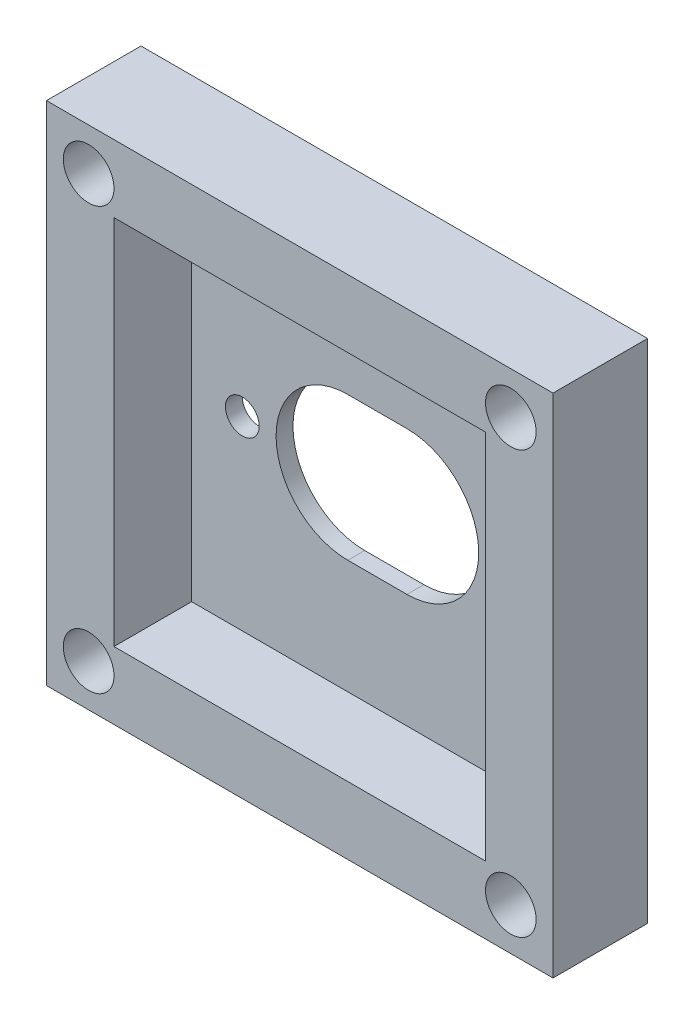
ISO-10303-21;
HEADER;
FILE_DESCRIPTION(('STEP AP214'),'2;1');
FILE_NAME('part.step','',(''),(''),'','','');
FILE_SCHEMA(('AUTOMOTIVE_DESIGN { 1 0 10303 214 1 1 1 1 }'));
ENDSEC;
DATA;
#1=APPLICATION_CONTEXT('core data for automotive mechanical design processes');
#2=APPLICATION_PROTOCOL_DEFINITION('international standard','automotive_design',2000,#1);
#3=PRODUCT_CONTEXT('',#1,'mechanical');
#4=PRODUCT('Part','Part','',(#3));
#5=PRODUCT_RELATED_PRODUCT_CATEGORY('part','',(#4));
#6=PRODUCT_DEFINITION_FORMATION('','',#4);
#7=PRODUCT_DEFINITION_CONTEXT('part definition',#1,'design');
#8=PRODUCT_DEFINITION('design','',#6,#7);
#9=PRODUCT_DEFINITION_SHAPE('','',#8);
#10=(LENGTH_UNIT() NAMED_UNIT(*) SI_UNIT(.MILLI.,.METRE.));
#11=(NAMED_UNIT(*) PLANE_ANGLE_UNIT() SI_UNIT($,.RADIAN.));
#12=(NAMED_UNIT(*) SI_UNIT($,.STERADIAN.) SOLID_ANGLE_UNIT());
#13=UNCERTAINTY_MEASURE_WITH_UNIT(LENGTH_MEASURE(1.E-05),#10,'distance_accuracy_value','');
#14=(GEOMETRIC_REPRESENTATION_CONTEXT(3) GLOBAL_UNCERTAINTY_ASSIGNED_CONTEXT((#13)) GLOBAL_UNIT_ASSIGNED_CONTEXT((#10,
#11,#12)) REPRESENTATION_CONTEXT('',''));
#15=CARTESIAN_POINT('',(0.,0.,0.));
#16=DIRECTION('',(0.,0.,1.));
#17=DIRECTION('',(1.,0.,0.));
#18=AXIS2_PLACEMENT_3D('',#15,#16,#17);
#19=CARTESIAN_POINT('',(-15.,-15.,-0.999999999999993));
#20=DIRECTION('',(0.,-1.,0.));
#21=DIRECTION('',(0.,0.,-1.));
#22=AXIS2_PLACEMENT_3D('',#19,#20,#21);
#23=PLANE('',#22);
#24=DIRECTION('',(0.,0.,1.));
#25=VECTOR('',#24,1.);
#26=CARTESIAN_POINT('',(15.,-15.,-0.999999999999993));
#27=LINE('',#26,#25);
#28=CARTESIAN_POINT('',(15.,-15.,-0.999999999999993));
#29=VERTEX_POINT('',#28);
#30=CARTESIAN_POINT('',(15.,-15.,4.6));
#31=VERTEX_POINT('',#30);
#32=EDGE_CURVE('E153',#29,#31,#27,.T.);
#33=ORIENTED_EDGE('',*,*,#32,.T.);
#34=DIRECTION('',(-1.,0.,0.));
#35=VECTOR('',#34,1.);
#36=CARTESIAN_POINT('',(31.,-15.,4.60000000000001));
#37=LINE('',#36,#35);
#38=CARTESIAN_POINT('',(-15.,-15.,4.60000000000001));
#39=VERTEX_POINT('',#38);
#40=EDGE_CURVE('E57',#31,#39,#37,.T.);
#41=ORIENTED_EDGE('',*,*,#40,.T.);
#42=DIRECTION('',(0.,0.,1.));
#43=VECTOR('',#42,1.);
#44=CARTESIAN_POINT('',(-15.,-15.,-0.999999999999993));
#45=LINE('',#44,#43);
#46=CARTESIAN_POINT('',(-15.,-15.,-0.999999999999993));
#47=VERTEX_POINT('',#46);
#48=EDGE_CURVE('E138',#47,#39,#45,.T.);
#49=ORIENTED_EDGE('',*,*,#48,.F.);
#50=DIRECTION('',(1.,0.,0.));
#51=VECTOR('',#50,1.);
#52=CARTESIAN_POINT('',(-15.,-15.,-0.999999999999993));
#53=LINE('',#52,#51);
#54=EDGE_CURVE('E155',#47,#29,#53,.T.);
#55=ORIENTED_EDGE('',*,*,#54,.T.);
#56=EDGE_LOOP('',(#33,#41,#49,#55));
#57=FACE_BOUND('',#56,.T.);
#58=ADVANCED_FACE('F39',(#57),#23,.T.);
#59=CARTESIAN_POINT('',(0.,0.,0.));
#60=DIRECTION('',(0.,0.,1.));
#61=DIRECTION('',(1.,0.,0.));
#62=AXIS2_PLACEMENT_3D('',#59,#60,#61);
#63=PLANE('',#62);
#64=CARTESIAN_POINT('',(-1.75,0.,0.));
#65=DIRECTION('',(0.,0.,1.));
#66=DIRECTION('',(1.,0.,0.));
#67=AXIS2_PLACEMENT_3D('',#64,#65,#66);
#68=CIRCLE('',#67,4.25);
#69=CARTESIAN_POINT('',(-1.75,4.25,0.));
#70=VERTEX_POINT('',#69);
#71=CARTESIAN_POINT('',(-1.75,-4.25,0.));
#72=VERTEX_POINT('',#71);
#73=EDGE_CURVE('E190',#70,#72,#68,.T.);
#74=ORIENTED_EDGE('',*,*,#73,.F.);
#75=DIRECTION('',(-1.,0.,0.));
#76=VECTOR('',#75,1.);
#77=CARTESIAN_POINT('',(-1.75,4.25,0.));
#78=LINE('',#77,#76);
#79=CARTESIAN_POINT('',(1.75,4.25,0.));
#80=VERTEX_POINT('',#79);
#81=EDGE_CURVE('E180',#80,#70,#78,.T.);
#82=ORIENTED_EDGE('',*,*,#81,.F.);
#83=CARTESIAN_POINT('',(1.75,0.,0.));
#84=DIRECTION('',(0.,0.,1.));
#85=DIRECTION('',(1.,0.,0.));
#86=AXIS2_PLACEMENT_3D('',#83,#84,#85);
#87=CIRCLE('',#86,4.25);
#88=CARTESIAN_POINT('',(1.75000000000004,-4.25,0.));
#89=VERTEX_POINT('',#88);
#90=EDGE_CURVE('E181',#89,#80,#87,.T.);
#91=ORIENTED_EDGE('',*,*,#90,.F.);
#92=DIRECTION('',(1.,0.,0.));
#93=VECTOR('',#92,1.);
#94=CARTESIAN_POINT('',(1.75000000000004,-4.25,0.));
#95=LINE('',#94,#93);
#96=EDGE_CURVE('E183',#72,#89,#95,.T.);
#97=ORIENTED_EDGE('',*,*,#96,.F.);
#98=EDGE_LOOP('',(#74,#82,#91,#97));
#99=FACE_BOUND('',#98,.T.);
#100=CARTESIAN_POINT('',(-8.,0.,0.));
#101=DIRECTION('',(0.,0.,1.));
#102=DIRECTION('',(1.,0.,0.));
#103=AXIS2_PLACEMENT_3D('',#100,#101,#102);
#104=CIRCLE('',#103,1.);
#105=CARTESIAN_POINT('',(-7.,0.,0.));
#106=VERTEX_POINT('',#105);
#107=EDGE_CURVE('E199',#106,#106,#104,.T.);
#108=ORIENTED_EDGE('',*,*,#107,.F.);
#109=EDGE_LOOP('',(#108));
#110=FACE_BOUND('',#109,.T.);
#111=CARTESIAN_POINT('',(8.,0.,0.));
#112=DIRECTION('',(0.,0.,1.));
#113=DIRECTION('',(1.,0.,0.));
#114=AXIS2_PLACEMENT_3D('',#111,#112,#113);
#115=CIRCLE('',#114,1.);
#116=CARTESIAN_POINT('',(9.,0.,0.));
#117=VERTEX_POINT('',#116);
#118=EDGE_CURVE('E207',#117,#117,#115,.T.);
#119=ORIENTED_EDGE('',*,*,#118,.F.);
#120=EDGE_LOOP('',(#119));
#121=FACE_BOUND('',#120,.T.);
#122=DIRECTION('',(-1.,0.,0.));
#123=VECTOR('',#122,1.);
#124=CARTESIAN_POINT('',(-11.,11.,0.));
#125=LINE('',#124,#123);
#126=CARTESIAN_POINT('',(11.,11.,0.));
#127=VERTEX_POINT('',#126);
#128=CARTESIAN_POINT('',(-11.,11.,0.));
#129=VERTEX_POINT('',#128);
#130=EDGE_CURVE('E217',#127,#129,#125,.T.);
#131=ORIENTED_EDGE('',*,*,#130,.T.);
#132=DIRECTION('',(0.,-1.,0.));
#133=VECTOR('',#132,1.);
#134=CARTESIAN_POINT('',(-11.,11.,0.));
#135=LINE('',#134,#133);
#136=CARTESIAN_POINT('',(-11.,-11.,0.));
#137=VERTEX_POINT('',#136);
#138=EDGE_CURVE('E226',#129,#137,#135,.T.);
#139=ORIENTED_EDGE('',*,*,#138,.T.);
#140=DIRECTION('',(1.,0.,0.));
#141=VECTOR('',#140,1.);
#142=CARTESIAN_POINT('',(-11.,-11.,0.));
#143=LINE('',#142,#141);
#144=CARTESIAN_POINT('',(11.,-11.,0.));
#145=VERTEX_POINT('',#144);
#146=EDGE_CURVE('E223',#137,#145,#143,.T.);
#147=ORIENTED_EDGE('',*,*,#146,.T.);
#148=DIRECTION('',(0.,1.,0.));
#149=VECTOR('',#148,1.);
#150=CARTESIAN_POINT('',(11.,11.,0.));
#151=LINE('',#150,#149);
#152=EDGE_CURVE('E224',#145,#127,#151,.T.);
#153=ORIENTED_EDGE('',*,*,#152,.T.);
#154=EDGE_LOOP('',(#131,#139,#147,#153));
#155=FACE_BOUND('',#154,.T.);
#156=ADVANCED_FACE('F306',(#99,#110,#121,#155),#63,.T.);
#157=CARTESIAN_POINT('',(-15.,15.,-0.999999999999993));
#158=DIRECTION('',(-1.,0.,0.));
#159=DIRECTION('',(0.,-1.,0.));
#160=AXIS2_PLACEMENT_3D('',#157,#158,#159);
#161=PLANE('',#160);
#162=DIRECTION('',(0.,-1.,0.));
#163=VECTOR('',#162,1.);
#164=CARTESIAN_POINT('',(-15.,15.,4.6));
#165=LINE('',#164,#163);
#166=CARTESIAN_POINT('',(-15.,15.,4.6));
#167=VERTEX_POINT('',#166);
#168=EDGE_CURVE('E133',#167,#39,#165,.T.);
#169=ORIENTED_EDGE('',*,*,#168,.F.);
#170=DIRECTION('',(0.,0.,1.));
#171=VECTOR('',#170,1.);
#172=CARTESIAN_POINT('',(-15.,15.,-0.999999999999993));
#173=LINE('',#172,#171);
#174=CARTESIAN_POINT('',(-15.,15.,-0.999999999999993));
#175=VERTEX_POINT('',#174);
#176=EDGE_CURVE('E11',#175,#167,#173,.T.);
#177=ORIENTED_EDGE('',*,*,#176,.F.);
#178=DIRECTION('',(0.,-1.,0.));
#179=VECTOR('',#178,1.);
#180=CARTESIAN_POINT('',(-15.,15.,-0.999999999999993));
#181=LINE('',#180,#179);
#182=EDGE_CURVE('E165',#175,#47,#181,.T.);
#183=ORIENTED_EDGE('',*,*,#182,.T.);
#184=ORIENTED_EDGE('',*,*,#48,.T.);
#185=EDGE_LOOP('',(#169,#177,#183,#184));
#186=FACE_BOUND('',#185,.T.);
#187=ADVANCED_FACE('F41',(#186),#161,.T.);
#188=CARTESIAN_POINT('',(-15.,15.,-0.999999999999993));
#189=DIRECTION('',(0.,1.,0.));
#190=DIRECTION('',(0.,0.,1.));
#191=AXIS2_PLACEMENT_3D('',#188,#189,#190);
#192=PLANE('',#191);
#193=DIRECTION('',(-1.,0.,0.));
#194=VECTOR('',#193,1.);
#195=CARTESIAN_POINT('',(31.,15.,4.6));
#196=LINE('',#195,#194);
#197=CARTESIAN_POINT('',(15.,15.,4.6));
#198=VERTEX_POINT('',#197);
#199=EDGE_CURVE('E127',#198,#167,#196,.T.);
#200=ORIENTED_EDGE('',*,*,#199,.F.);
#201=DIRECTION('',(0.,0.,1.));
#202=VECTOR('',#201,1.);
#203=CARTESIAN_POINT('',(15.,15.,-0.999999999999993));
#204=LINE('',#203,#202);
#205=CARTESIAN_POINT('',(15.,15.,-0.999999999999993));
#206=VERTEX_POINT('',#205);
#207=EDGE_CURVE('E48',#206,#198,#204,.T.);
#208=ORIENTED_EDGE('',*,*,#207,.F.);
#209=DIRECTION('',(-1.,0.,0.));
#210=VECTOR('',#209,1.);
#211=CARTESIAN_POINT('',(-15.,15.,-0.999999999999993));
#212=LINE('',#211,#210);
#213=EDGE_CURVE('E143',#206,#175,#212,.T.);
#214=ORIENTED_EDGE('',*,*,#213,.T.);
#215=ORIENTED_EDGE('',*,*,#176,.T.);
#216=EDGE_LOOP('',(#200,#208,#214,#215));
#217=FACE_BOUND('',#216,.T.);
#218=ADVANCED_FACE('F141',(#217),#192,.T.);
#219=CARTESIAN_POINT('',(15.,15.,-0.999999999999993));
#220=DIRECTION('',(1.,0.,0.));
#221=DIRECTION('',(0.,0.,-1.));
#222=AXIS2_PLACEMENT_3D('',#219,#220,#221);
#223=PLANE('',#222);
#224=DIRECTION('',(0.,1.,0.));
#225=VECTOR('',#224,1.);
#226=CARTESIAN_POINT('',(15.,15.,4.6));
#227=LINE('',#226,#225);
#228=EDGE_CURVE('E135',#31,#198,#227,.T.);
#229=ORIENTED_EDGE('',*,*,#228,.F.);
#230=ORIENTED_EDGE('',*,*,#32,.F.);
#231=DIRECTION('',(0.,1.,0.));
#232=VECTOR('',#231,1.);
#233=CARTESIAN_POINT('',(15.,15.,-0.999999999999993));
#234=LINE('',#233,#232);
#235=EDGE_CURVE('E148',#29,#206,#234,.T.);
#236=ORIENTED_EDGE('',*,*,#235,.T.);
#237=ORIENTED_EDGE('',*,*,#207,.T.);
#238=EDGE_LOOP('',(#229,#230,#236,#237));
#239=FACE_BOUND('',#238,.T.);
#240=ADVANCED_FACE('F162',(#239),#223,.T.);
#241=CARTESIAN_POINT('',(0.,0.,-0.999999999999993));
#242=DIRECTION('',(0.,0.,1.));
#243=DIRECTION('',(1.,0.,0.));
#244=AXIS2_PLACEMENT_3D('',#241,#242,#243);
#245=PLANE('',#244);
#246=CARTESIAN_POINT('',(-12.5,-12.5,-0.999999999999994));
#247=DIRECTION('',(0.,0.,1.));
#248=DIRECTION('',(1.,0.,0.));
#249=AXIS2_PLACEMENT_3D('',#246,#247,#248);
#250=CIRCLE('',#249,1.5);
#251=CARTESIAN_POINT('',(-11.,-12.5,-0.999999999999994));
#252=VERTEX_POINT('',#251);
#253=EDGE_CURVE('E233',#252,#252,#250,.T.);
#254=ORIENTED_EDGE('',*,*,#253,.T.);
#255=EDGE_LOOP('',(#254));
#256=FACE_BOUND('',#255,.T.);
#257=CARTESIAN_POINT('',(12.5,-12.5,-0.999999999999994));
#258=DIRECTION('',(0.,0.,1.));
#259=DIRECTION('',(1.,0.,0.));
#260=AXIS2_PLACEMENT_3D('',#257,#258,#259);
#261=CIRCLE('',#260,1.5);
#262=CARTESIAN_POINT('',(14.,-12.5,-0.999999999999994));
#263=VERTEX_POINT('',#262);
#264=EDGE_CURVE('E234',#263,#263,#261,.T.);
#265=ORIENTED_EDGE('',*,*,#264,.T.);
#266=EDGE_LOOP('',(#265));
#267=FACE_BOUND('',#266,.T.);
#268=CARTESIAN_POINT('',(12.5,12.5,-0.999999999999994));
#269=DIRECTION('',(0.,0.,1.));
#270=DIRECTION('',(1.,0.,0.));
#271=AXIS2_PLACEMENT_3D('',#268,#269,#270);
#272=CIRCLE('',#271,1.5);
#273=CARTESIAN_POINT('',(14.,12.5,-0.999999999999994));
#274=VERTEX_POINT('',#273);
#275=EDGE_CURVE('E240',#274,#274,#272,.T.);
#276=ORIENTED_EDGE('',*,*,#275,.T.);
#277=EDGE_LOOP('',(#276));
#278=FACE_BOUND('',#277,.T.);
#279=CARTESIAN_POINT('',(-12.5,12.5,-0.999999999999994));
#280=DIRECTION('',(0.,0.,1.));
#281=DIRECTION('',(1.,0.,0.));
#282=AXIS2_PLACEMENT_3D('',#279,#280,#281);
#283=CIRCLE('',#282,1.5);
#284=CARTESIAN_POINT('',(-11.,12.5,-0.999999999999994));
#285=VERTEX_POINT('',#284);
#286=EDGE_CURVE('E239',#285,#285,#283,.T.);
#287=ORIENTED_EDGE('',*,*,#286,.T.);
#288=EDGE_LOOP('',(#287));
#289=FACE_BOUND('',#288,.T.);
#290=CARTESIAN_POINT('',(8.,0.,-0.999999999999993));
#291=DIRECTION('',(0.,0.,1.));
#292=DIRECTION('',(1.,0.,0.));
#293=AXIS2_PLACEMENT_3D('',#290,#291,#292);
#294=CIRCLE('',#293,1.);
#295=CARTESIAN_POINT('',(9.,0.,-0.999999999999993));
#296=VERTEX_POINT('',#295);
#297=EDGE_CURVE('E205',#296,#296,#294,.T.);
#298=ORIENTED_EDGE('',*,*,#297,.T.);
#299=EDGE_LOOP('',(#298));
#300=FACE_BOUND('',#299,.T.);
#301=CARTESIAN_POINT('',(-8.,0.,-0.999999999999993));
#302=DIRECTION('',(0.,0.,1.));
#303=DIRECTION('',(1.,0.,0.));
#304=AXIS2_PLACEMENT_3D('',#301,#302,#303);
#305=CIRCLE('',#304,1.);
#306=CARTESIAN_POINT('',(-7.,0.,-0.999999999999993));
#307=VERTEX_POINT('',#306);
#308=EDGE_CURVE('E186',#307,#307,#305,.T.);
#309=ORIENTED_EDGE('',*,*,#308,.T.);
#310=EDGE_LOOP('',(#309));
#311=FACE_BOUND('',#310,.T.);
#312=DIRECTION('',(-1.,0.,0.));
#313=VECTOR('',#312,1.);
#314=CARTESIAN_POINT('',(-1.75,4.25,-0.999999999999993));
#315=LINE('',#314,#313);
#316=CARTESIAN_POINT('',(1.75,4.25,-0.999999999999993));
#317=VERTEX_POINT('',#316);
#318=CARTESIAN_POINT('',(-1.75,4.25,-0.999999999999993));
#319=VERTEX_POINT('',#318);
#320=EDGE_CURVE('E172',#317,#319,#315,.T.);
#321=ORIENTED_EDGE('',*,*,#320,.T.);
#322=CARTESIAN_POINT('',(-1.75,0.,-0.999999999999993));
#323=DIRECTION('',(0.,0.,1.));
#324=DIRECTION('',(1.,0.,0.));
#325=AXIS2_PLACEMENT_3D('',#322,#323,#324);
#326=CIRCLE('',#325,4.25);
#327=CARTESIAN_POINT('',(-1.75,-4.25,-0.999999999999993));
#328=VERTEX_POINT('',#327);
#329=EDGE_CURVE('E179',#319,#328,#326,.T.);
#330=ORIENTED_EDGE('',*,*,#329,.T.);
#331=DIRECTION('',(1.,0.,0.));
#332=VECTOR('',#331,1.);
#333=CARTESIAN_POINT('',(1.75000000000004,-4.25,-0.999999999999993));
#334=LINE('',#333,#332);
#335=CARTESIAN_POINT('',(1.75000000000004,-4.25,-0.999999999999993));
#336=VERTEX_POINT('',#335);
#337=EDGE_CURVE('E194',#328,#336,#334,.T.);
#338=ORIENTED_EDGE('',*,*,#337,.T.);
#339=CARTESIAN_POINT('',(1.75,0.,-0.999999999999993));
#340=DIRECTION('',(0.,0.,1.));
#341=DIRECTION('',(1.,0.,0.));
#342=AXIS2_PLACEMENT_3D('',#339,#340,#341);
#343=CIRCLE('',#342,4.25);
#344=EDGE_CURVE('E195',#336,#317,#343,.T.);
#345=ORIENTED_EDGE('',*,*,#344,.T.);
#346=EDGE_LOOP('',(#321,#330,#338,#345));
#347=FACE_BOUND('',#346,.T.);
#348=ORIENTED_EDGE('',*,*,#182,.F.);
#349=ORIENTED_EDGE('',*,*,#213,.F.);
#350=ORIENTED_EDGE('',*,*,#235,.F.);
#351=ORIENTED_EDGE('',*,*,#54,.F.);
#352=EDGE_LOOP('',(#348,#349,#350,#351));
#353=FACE_BOUND('',#352,.T.);
#354=ADVANCED_FACE('F161',(#256,#267,#278,#289,#300,#311,#347,#353),#245,.F.);
#355=CARTESIAN_POINT('',(-1.75,0.,-0.999999999999993));
#356=DIRECTION('',(0.,0.,1.));
#357=DIRECTION('',(1.,0.,0.));
#358=AXIS2_PLACEMENT_3D('',#355,#356,#357);
#359=CYLINDRICAL_SURFACE('',#358,4.25);
#360=ORIENTED_EDGE('',*,*,#73,.T.);
#361=DIRECTION('',(0.,0.,1.));
#362=VECTOR('',#361,1.);
#363=CARTESIAN_POINT('',(-1.75,-4.25,-0.999999999999993));
#364=LINE('',#363,#362);
#365=EDGE_CURVE('E167',#328,#72,#364,.T.);
#366=ORIENTED_EDGE('',*,*,#365,.F.);
#367=ORIENTED_EDGE('',*,*,#329,.F.);
#368=DIRECTION('',(0.,0.,1.));
#369=VECTOR('',#368,1.);
#370=CARTESIAN_POINT('',(-1.75,4.25,-0.999999999999993));
#371=LINE('',#370,#369);
#372=EDGE_CURVE('E164',#319,#70,#371,.T.);
#373=ORIENTED_EDGE('',*,*,#372,.T.);
#374=EDGE_LOOP('',(#360,#366,#367,#373));
#375=FACE_BOUND('',#374,.T.);
#376=ADVANCED_FACE('F281',(#375),#359,.F.);
#377=CARTESIAN_POINT('',(-1.75,4.25,-0.999999999999993));
#378=DIRECTION('',(0.,1.,0.));
#379=DIRECTION('',(0.,0.,1.));
#380=AXIS2_PLACEMENT_3D('',#377,#378,#379);
#381=PLANE('',#380);
#382=ORIENTED_EDGE('',*,*,#81,.T.);
#383=ORIENTED_EDGE('',*,*,#372,.F.);
#384=ORIENTED_EDGE('',*,*,#320,.F.);
#385=DIRECTION('',(0.,0.,1.));
#386=VECTOR('',#385,1.);
#387=CARTESIAN_POINT('',(1.75,4.25,-0.999999999999993));
#388=LINE('',#387,#386);
#389=EDGE_CURVE('E170',#317,#80,#388,.T.);
#390=ORIENTED_EDGE('',*,*,#389,.T.);
#391=EDGE_LOOP('',(#382,#383,#384,#390));
#392=FACE_BOUND('',#391,.T.);
#393=ADVANCED_FACE('F291',(#392),#381,.F.);
#394=CARTESIAN_POINT('',(1.75,0.,-0.999999999999993));
#395=DIRECTION('',(0.,0.,1.));
#396=DIRECTION('',(1.,0.,0.));
#397=AXIS2_PLACEMENT_3D('',#394,#395,#396);
#398=CYLINDRICAL_SURFACE('',#397,4.25);
#399=ORIENTED_EDGE('',*,*,#90,.T.);
#400=ORIENTED_EDGE('',*,*,#389,.F.);
#401=ORIENTED_EDGE('',*,*,#344,.F.);
#402=DIRECTION('',(0.,0.,1.));
#403=VECTOR('',#402,1.);
#404=CARTESIAN_POINT('',(1.75000000000004,-4.25,-0.999999999999993));
#405=LINE('',#404,#403);
#406=EDGE_CURVE('E173',#336,#89,#405,.T.);
#407=ORIENTED_EDGE('',*,*,#406,.T.);
#408=EDGE_LOOP('',(#399,#400,#401,#407));
#409=FACE_BOUND('',#408,.T.);
#410=ADVANCED_FACE('F302',(#409),#398,.F.);
#411=CARTESIAN_POINT('',(1.75000000000004,-4.25,-0.999999999999993));
#412=DIRECTION('',(0.,-1.,0.));
#413=DIRECTION('',(0.,0.,-1.));
#414=AXIS2_PLACEMENT_3D('',#411,#412,#413);
#415=PLANE('',#414);
#416=ORIENTED_EDGE('',*,*,#96,.T.);
#417=ORIENTED_EDGE('',*,*,#406,.F.);
#418=ORIENTED_EDGE('',*,*,#337,.F.);
#419=ORIENTED_EDGE('',*,*,#365,.T.);
#420=EDGE_LOOP('',(#416,#417,#418,#419));
#421=FACE_BOUND('',#420,.T.);
#422=ADVANCED_FACE('F301',(#421),#415,.F.);
#423=CARTESIAN_POINT('',(-8.,0.,-0.999999999999993));
#424=DIRECTION('',(0.,0.,1.));
#425=DIRECTION('',(1.,0.,0.));
#426=AXIS2_PLACEMENT_3D('',#423,#424,#425);
#427=CYLINDRICAL_SURFACE('',#426,1.);
#428=ORIENTED_EDGE('',*,*,#308,.F.);
#429=EDGE_LOOP('',(#428));
#430=FACE_BOUND('',#429,.T.);
#431=ORIENTED_EDGE('',*,*,#107,.T.);
#432=EDGE_LOOP('',(#431));
#433=FACE_BOUND('',#432,.T.);
#434=ADVANCED_FACE('F356',(#430,#433),#427,.F.);
#435=CARTESIAN_POINT('',(8.,0.,-0.999999999999993));
#436=DIRECTION('',(0.,0.,1.));
#437=DIRECTION('',(1.,0.,0.));
#438=AXIS2_PLACEMENT_3D('',#435,#436,#437);
#439=CYLINDRICAL_SURFACE('',#438,1.);
#440=ORIENTED_EDGE('',*,*,#297,.F.);
#441=EDGE_LOOP('',(#440));
#442=FACE_BOUND('',#441,.T.);
#443=ORIENTED_EDGE('',*,*,#118,.T.);
#444=EDGE_LOOP('',(#443));
#445=FACE_BOUND('',#444,.T.);
#446=ADVANCED_FACE('F362',(#442,#445),#439,.F.);
#447=CARTESIAN_POINT('',(-11.,11.,10.));
#448=DIRECTION('',(1.,0.,0.));
#449=DIRECTION('',(0.,1.,0.));
#450=AXIS2_PLACEMENT_3D('',#447,#448,#449);
#451=PLANE('',#450);
#452=DIRECTION('',(0.,1.,0.));
#453=VECTOR('',#452,1.);
#454=CARTESIAN_POINT('',(-11.,11.,4.6));
#455=LINE('',#454,#453);
#456=CARTESIAN_POINT('',(-11.,-11.,4.60000000000001));
#457=VERTEX_POINT('',#456);
#458=CARTESIAN_POINT('',(-11.,11.,4.6));
#459=VERTEX_POINT('',#458);
#460=EDGE_CURVE('E63',#457,#459,#455,.T.);
#461=ORIENTED_EDGE('',*,*,#460,.F.);
#462=DIRECTION('',(0.,0.,-1.));
#463=VECTOR('',#462,1.);
#464=CARTESIAN_POINT('',(-11.,-11.,10.));
#465=LINE('',#464,#463);
#466=EDGE_CURVE('E209',#457,#137,#465,.T.);
#467=ORIENTED_EDGE('',*,*,#466,.T.);
#468=ORIENTED_EDGE('',*,*,#138,.F.);
#469=DIRECTION('',(0.,0.,-1.));
#470=VECTOR('',#469,1.);
#471=CARTESIAN_POINT('',(-11.,11.,10.));
#472=LINE('',#471,#470);
#473=EDGE_CURVE('E220',#459,#129,#472,.T.);
#474=ORIENTED_EDGE('',*,*,#473,.F.);
#475=EDGE_LOOP('',(#461,#467,#468,#474));
#476=FACE_BOUND('',#475,.T.);
#477=ADVANCED_FACE('F321',(#476),#451,.T.);
#478=CARTESIAN_POINT('',(-11.,-11.,10.));
#479=DIRECTION('',(0.,1.,0.));
#480=DIRECTION('',(0.,0.,1.));
#481=AXIS2_PLACEMENT_3D('',#478,#479,#480);
#482=PLANE('',#481);
#483=DIRECTION('',(-1.,0.,0.));
#484=VECTOR('',#483,1.);
#485=CARTESIAN_POINT('',(-11.,-11.,4.60000000000001));
#486=LINE('',#485,#484);
#487=CARTESIAN_POINT('',(11.,-11.,4.60000000000001));
#488=VERTEX_POINT('',#487);
#489=EDGE_CURVE('E244',#488,#457,#486,.T.);
#490=ORIENTED_EDGE('',*,*,#489,.F.);
#491=DIRECTION('',(0.,0.,-1.));
#492=VECTOR('',#491,1.);
#493=CARTESIAN_POINT('',(11.,-11.,10.));
#494=LINE('',#493,#492);
#495=EDGE_CURVE('E212',#488,#145,#494,.T.);
#496=ORIENTED_EDGE('',*,*,#495,.T.);
#497=ORIENTED_EDGE('',*,*,#146,.F.);
#498=ORIENTED_EDGE('',*,*,#466,.F.);
#499=EDGE_LOOP('',(#490,#496,#497,#498));
#500=FACE_BOUND('',#499,.T.);
#501=ADVANCED_FACE('F328',(#500),#482,.T.);
#502=CARTESIAN_POINT('',(11.,11.,10.));
#503=DIRECTION('',(-1.,0.,0.));
#504=DIRECTION('',(0.,-1.,0.));
#505=AXIS2_PLACEMENT_3D('',#502,#503,#504);
#506=PLANE('',#505);
#507=DIRECTION('',(0.,-1.,0.));
#508=VECTOR('',#507,1.);
#509=CARTESIAN_POINT('',(11.,11.,4.6));
#510=LINE('',#509,#508);
#511=CARTESIAN_POINT('',(11.,11.,4.6));
#512=VERTEX_POINT('',#511);
#513=EDGE_CURVE('E250',#512,#488,#510,.T.);
#514=ORIENTED_EDGE('',*,*,#513,.F.);
#515=DIRECTION('',(0.,0.,-1.));
#516=VECTOR('',#515,1.);
#517=CARTESIAN_POINT('',(11.,11.,10.));
#518=LINE('',#517,#516);
#519=EDGE_CURVE('E214',#512,#127,#518,.T.);
#520=ORIENTED_EDGE('',*,*,#519,.T.);
#521=ORIENTED_EDGE('',*,*,#152,.F.);
#522=ORIENTED_EDGE('',*,*,#495,.F.);
#523=EDGE_LOOP('',(#514,#520,#521,#522));
#524=FACE_BOUND('',#523,.T.);
#525=ADVANCED_FACE('F329',(#524),#506,.T.);
#526=CARTESIAN_POINT('',(-11.,11.,10.));
#527=DIRECTION('',(0.,-1.,0.));
#528=DIRECTION('',(0.,0.,-1.));
#529=AXIS2_PLACEMENT_3D('',#526,#527,#528);
#530=PLANE('',#529);
#531=DIRECTION('',(1.,0.,0.));
#532=VECTOR('',#531,1.);
#533=CARTESIAN_POINT('',(-11.,11.,4.6));
#534=LINE('',#533,#532);
#535=EDGE_CURVE('E248',#459,#512,#534,.T.);
#536=ORIENTED_EDGE('',*,*,#535,.F.);
#537=ORIENTED_EDGE('',*,*,#473,.T.);
#538=ORIENTED_EDGE('',*,*,#130,.F.);
#539=ORIENTED_EDGE('',*,*,#519,.F.);
#540=EDGE_LOOP('',(#536,#537,#538,#539));
#541=FACE_BOUND('',#540,.T.);
#542=ADVANCED_FACE('F280',(#541),#530,.T.);
#543=CARTESIAN_POINT('',(-12.5,12.5,-34.));
#544=DIRECTION('',(0.,0.,1.));
#545=DIRECTION('',(1.,0.,0.));
#546=AXIS2_PLACEMENT_3D('',#543,#544,#545);
#547=CYLINDRICAL_SURFACE('',#546,1.5);
#548=CARTESIAN_POINT('',(-12.5,12.5,4.6));
#549=DIRECTION('',(0.,0.,-1.));
#550=DIRECTION('',(0.,1.,0.));
#551=AXIS2_PLACEMENT_3D('',#548,#549,#550);
#552=CIRCLE('',#551,1.5);
#553=CARTESIAN_POINT('',(-12.5,14.,4.6));
#554=VERTEX_POINT('',#553);
#555=EDGE_CURVE('E252',#554,#554,#552,.F.);
#556=ORIENTED_EDGE('',*,*,#555,.T.);
#557=EDGE_LOOP('',(#556));
#558=FACE_BOUND('',#557,.T.);
#559=ORIENTED_EDGE('',*,*,#286,.F.);
#560=EDGE_LOOP('',(#559));
#561=FACE_BOUND('',#560,.T.);
#562=ADVANCED_FACE('F271',(#558,#561),#547,.F.);
#563=CARTESIAN_POINT('',(12.5,12.5,-34.));
#564=DIRECTION('',(0.,0.,1.));
#565=DIRECTION('',(1.,0.,0.));
#566=AXIS2_PLACEMENT_3D('',#563,#564,#565);
#567=CYLINDRICAL_SURFACE('',#566,1.5);
#568=CARTESIAN_POINT('',(12.5,12.5,4.6));
#569=DIRECTION('',(0.,0.,-1.));
#570=DIRECTION('',(0.,1.,0.));
#571=AXIS2_PLACEMENT_3D('',#568,#569,#570);
#572=CIRCLE('',#571,1.5);
#573=CARTESIAN_POINT('',(12.5,14.,4.6));
#574=VERTEX_POINT('',#573);
#575=EDGE_CURVE('E251',#574,#574,#572,.F.);
#576=ORIENTED_EDGE('',*,*,#575,.T.);
#577=EDGE_LOOP('',(#576));
#578=FACE_BOUND('',#577,.T.);
#579=ORIENTED_EDGE('',*,*,#275,.F.);
#580=EDGE_LOOP('',(#579));
#581=FACE_BOUND('',#580,.T.);
#582=ADVANCED_FACE('F276',(#578,#581),#567,.F.);
#583=CARTESIAN_POINT('',(12.5,-12.5,-34.));
#584=DIRECTION('',(0.,0.,1.));
#585=DIRECTION('',(1.,0.,0.));
#586=AXIS2_PLACEMENT_3D('',#583,#584,#585);
#587=CYLINDRICAL_SURFACE('',#586,1.5);
#588=CARTESIAN_POINT('',(12.5,-12.5,4.6));
#589=DIRECTION('',(0.,0.,-1.));
#590=DIRECTION('',(0.,1.,0.));
#591=AXIS2_PLACEMENT_3D('',#588,#589,#590);
#592=CIRCLE('',#591,1.5);
#593=CARTESIAN_POINT('',(12.5,-11.,4.6));
#594=VERTEX_POINT('',#593);
#595=EDGE_CURVE('E260',#594,#594,#592,.F.);
#596=ORIENTED_EDGE('',*,*,#595,.T.);
#597=EDGE_LOOP('',(#596));
#598=FACE_BOUND('',#597,.T.);
#599=ORIENTED_EDGE('',*,*,#264,.F.);
#600=EDGE_LOOP('',(#599));
#601=FACE_BOUND('',#600,.T.);
#602=ADVANCED_FACE('F337',(#598,#601),#587,.F.);
#603=CARTESIAN_POINT('',(-12.5,-12.5,-34.));
#604=DIRECTION('',(0.,0.,1.));
#605=DIRECTION('',(1.,0.,0.));
#606=AXIS2_PLACEMENT_3D('',#603,#604,#605);
#607=CYLINDRICAL_SURFACE('',#606,1.5);
#608=CARTESIAN_POINT('',(-12.5,-12.5,4.6));
#609=DIRECTION('',(0.,0.,-1.));
#610=DIRECTION('',(0.,1.,0.));
#611=AXIS2_PLACEMENT_3D('',#608,#609,#610);
#612=CIRCLE('',#611,1.5);
#613=CARTESIAN_POINT('',(-12.5,-11.,4.6));
#614=VERTEX_POINT('',#613);
#615=EDGE_CURVE('E43',#614,#614,#612,.F.);
#616=ORIENTED_EDGE('',*,*,#615,.T.);
#617=EDGE_LOOP('',(#616));
#618=FACE_BOUND('',#617,.T.);
#619=ORIENTED_EDGE('',*,*,#253,.F.);
#620=EDGE_LOOP('',(#619));
#621=FACE_BOUND('',#620,.T.);
#622=ADVANCED_FACE('F261',(#618,#621),#607,.F.);
#623=CARTESIAN_POINT('',(31.,15.,4.6));
#624=DIRECTION('',(0.,0.,-1.));
#625=DIRECTION('',(0.,1.,0.));
#626=AXIS2_PLACEMENT_3D('',#623,#624,#625);
#627=PLANE('',#626);
#628=ORIENTED_EDGE('',*,*,#228,.T.);
#629=ORIENTED_EDGE('',*,*,#199,.T.);
#630=ORIENTED_EDGE('',*,*,#168,.T.);
#631=ORIENTED_EDGE('',*,*,#40,.F.);
#632=EDGE_LOOP('',(#628,#629,#630,#631));
#633=FACE_BOUND('',#632,.T.);
#634=ORIENTED_EDGE('',*,*,#460,.T.);
#635=ORIENTED_EDGE('',*,*,#535,.T.);
#636=ORIENTED_EDGE('',*,*,#513,.T.);
#637=ORIENTED_EDGE('',*,*,#489,.T.);
#638=EDGE_LOOP('',(#634,#635,#636,#637));
#639=FACE_BOUND('',#638,.T.);
#640=ORIENTED_EDGE('',*,*,#575,.F.);
#641=EDGE_LOOP('',(#640));
#642=FACE_BOUND('',#641,.T.);
#643=ORIENTED_EDGE('',*,*,#615,.F.);
#644=EDGE_LOOP('',(#643));
#645=FACE_BOUND('',#644,.T.);
#646=ORIENTED_EDGE('',*,*,#595,.F.);
#647=EDGE_LOOP('',(#646));
#648=FACE_BOUND('',#647,.T.);
#649=ORIENTED_EDGE('',*,*,#555,.F.);
#650=EDGE_LOOP('',(#649));
#651=FACE_BOUND('',#650,.T.);
#652=ADVANCED_FACE('F129',(#633,#639,#642,#645,#648,#651),#627,.F.);
#653=CLOSED_SHELL('',(#58,#156,#187,#218,#240,#354,#376,#393,#410,#422,#434,#446,#477,#501,#525,
#542,#562,#582,#602,#622,#652));
#654=MANIFOLD_SOLID_BREP('B2',#653);
#655=ADVANCED_BREP_SHAPE_REPRESENTATION('',(#18,#654),#14);
#656=SHAPE_DEFINITION_REPRESENTATION(#9,#655);
ENDSEC;
END-ISO-10303-21;
